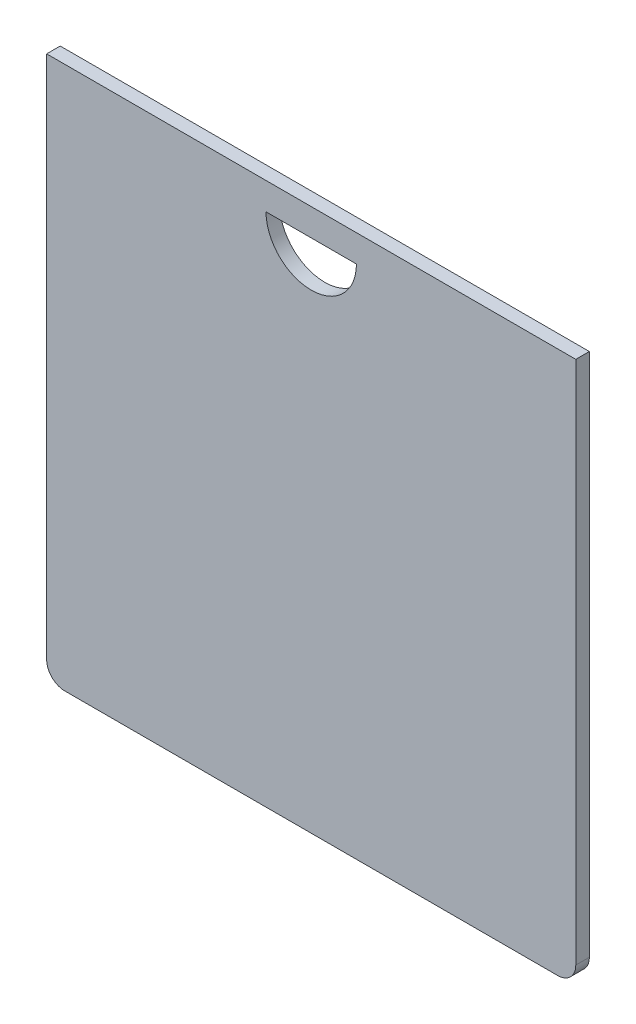
ISO-10303-21;
HEADER;
FILE_DESCRIPTION(('STEP AP214'),'2;1');
FILE_NAME('part.step','',(''),(''),'','','');
FILE_SCHEMA(('AUTOMOTIVE_DESIGN { 1 0 10303 214 1 1 1 1 }'));
ENDSEC;
DATA;
#1=APPLICATION_CONTEXT('core data for automotive mechanical design processes');
#2=APPLICATION_PROTOCOL_DEFINITION('international standard','automotive_design',2000,#1);
#3=PRODUCT_CONTEXT('',#1,'mechanical');
#4=PRODUCT('Part','Part','',(#3));
#5=PRODUCT_RELATED_PRODUCT_CATEGORY('part','',(#4));
#6=PRODUCT_DEFINITION_FORMATION('','',#4);
#7=PRODUCT_DEFINITION_CONTEXT('part definition',#1,'design');
#8=PRODUCT_DEFINITION('design','',#6,#7);
#9=PRODUCT_DEFINITION_SHAPE('','',#8);
#10=(LENGTH_UNIT() NAMED_UNIT(*) SI_UNIT(.MILLI.,.METRE.));
#11=(NAMED_UNIT(*) PLANE_ANGLE_UNIT() SI_UNIT($,.RADIAN.));
#12=(NAMED_UNIT(*) SI_UNIT($,.STERADIAN.) SOLID_ANGLE_UNIT());
#13=UNCERTAINTY_MEASURE_WITH_UNIT(LENGTH_MEASURE(1.E-05),#10,'distance_accuracy_value','');
#14=(GEOMETRIC_REPRESENTATION_CONTEXT(3) GLOBAL_UNCERTAINTY_ASSIGNED_CONTEXT((#13)) GLOBAL_UNIT_ASSIGNED_CONTEXT((#10,
#11,#12)) REPRESENTATION_CONTEXT('',''));
#15=CARTESIAN_POINT('',(0.,0.,0.));
#16=DIRECTION('',(0.,0.,1.));
#17=DIRECTION('',(1.,0.,0.));
#18=AXIS2_PLACEMENT_3D('',#15,#16,#17);
#19=CARTESIAN_POINT('',(0.,60.,1.5));
#20=DIRECTION('',(1.,0.,0.));
#21=DIRECTION('',(0.,1.,0.));
#22=AXIS2_PLACEMENT_3D('',#19,#20,#21);
#23=PLANE('',#22);
#24=DIRECTION('',(0.,-1.,0.));
#25=VECTOR('',#24,1.);
#26=CARTESIAN_POINT('',(0.,60.,0.));
#27=LINE('',#26,#25);
#28=CARTESIAN_POINT('',(0.,60.,0.));
#29=VERTEX_POINT('',#28);
#30=CARTESIAN_POINT('',(0.,2.,0.));
#31=VERTEX_POINT('',#30);
#32=EDGE_CURVE('E113',#29,#31,#27,.T.);
#33=ORIENTED_EDGE('',*,*,#32,.T.);
#34=DIRECTION('',(0.,0.,-1.));
#35=VECTOR('',#34,1.);
#36=CARTESIAN_POINT('',(0.,2.,1.5));
#37=LINE('',#36,#35);
#38=CARTESIAN_POINT('',(0.,2.,1.5));
#39=VERTEX_POINT('',#38);
#40=EDGE_CURVE('E11',#31,#39,#37,.F.);
#41=ORIENTED_EDGE('',*,*,#40,.T.);
#42=DIRECTION('',(0.,-1.,0.));
#43=VECTOR('',#42,1.);
#44=CARTESIAN_POINT('',(0.,60.,1.5));
#45=LINE('',#44,#43);
#46=CARTESIAN_POINT('',(0.,60.,1.5));
#47=VERTEX_POINT('',#46);
#48=EDGE_CURVE('E115',#47,#39,#45,.T.);
#49=ORIENTED_EDGE('',*,*,#48,.F.);
#50=DIRECTION('',(0.,0.,-1.));
#51=VECTOR('',#50,1.);
#52=CARTESIAN_POINT('',(0.,60.,1.5));
#53=LINE('',#52,#51);
#54=EDGE_CURVE('E126',#47,#29,#53,.T.);
#55=ORIENTED_EDGE('',*,*,#54,.T.);
#56=EDGE_LOOP('',(#33,#41,#49,#55));
#57=FACE_BOUND('',#56,.T.);
#58=ADVANCED_FACE('F33',(#57),#23,.F.);
#59=CARTESIAN_POINT('',(0.,0.,1.5));
#60=DIRECTION('',(0.,1.,0.));
#61=DIRECTION('',(0.,0.,1.));
#62=AXIS2_PLACEMENT_3D('',#59,#60,#61);
#63=PLANE('',#62);
#64=DIRECTION('',(1.,0.,0.));
#65=VECTOR('',#64,1.);
#66=CARTESIAN_POINT('',(0.,0.,0.));
#67=LINE('',#66,#65);
#68=CARTESIAN_POINT('',(2.,0.,0.));
#69=VERTEX_POINT('',#68);
#70=CARTESIAN_POINT('',(56.5,0.,0.));
#71=VERTEX_POINT('',#70);
#72=EDGE_CURVE('E129',#69,#71,#67,.T.);
#73=ORIENTED_EDGE('',*,*,#72,.T.);
#74=DIRECTION('',(0.,0.,-1.));
#75=VECTOR('',#74,1.);
#76=CARTESIAN_POINT('',(56.5,0.,1.5));
#77=LINE('',#76,#75);
#78=CARTESIAN_POINT('',(56.5,0.,1.5));
#79=VERTEX_POINT('',#78);
#80=EDGE_CURVE('E150',#71,#79,#77,.F.);
#81=ORIENTED_EDGE('',*,*,#80,.T.);
#82=DIRECTION('',(1.,0.,0.));
#83=VECTOR('',#82,1.);
#84=CARTESIAN_POINT('',(0.,0.,1.5));
#85=LINE('',#84,#83);
#86=CARTESIAN_POINT('',(2.,0.,1.5));
#87=VERTEX_POINT('',#86);
#88=EDGE_CURVE('E118',#87,#79,#85,.T.);
#89=ORIENTED_EDGE('',*,*,#88,.F.);
#90=DIRECTION('',(0.,0.,-1.));
#91=VECTOR('',#90,1.);
#92=CARTESIAN_POINT('',(2.,0.,1.5));
#93=LINE('',#92,#91);
#94=EDGE_CURVE('E147',#87,#69,#93,.T.);
#95=ORIENTED_EDGE('',*,*,#94,.T.);
#96=EDGE_LOOP('',(#73,#81,#89,#95));
#97=FACE_BOUND('',#96,.T.);
#98=ADVANCED_FACE('F170',(#97),#63,.F.);
#99=CARTESIAN_POINT('',(58.5,60.,1.5));
#100=DIRECTION('',(-1.,0.,0.));
#101=DIRECTION('',(0.,-1.,0.));
#102=AXIS2_PLACEMENT_3D('',#99,#100,#101);
#103=PLANE('',#102);
#104=DIRECTION('',(0.,1.,0.));
#105=VECTOR('',#104,1.);
#106=CARTESIAN_POINT('',(58.5,60.,1.5));
#107=LINE('',#106,#105);
#108=CARTESIAN_POINT('',(58.5,2.,1.5));
#109=VERTEX_POINT('',#108);
#110=CARTESIAN_POINT('',(58.5,60.,1.5));
#111=VERTEX_POINT('',#110);
#112=EDGE_CURVE('E122',#109,#111,#107,.T.);
#113=ORIENTED_EDGE('',*,*,#112,.F.);
#114=DIRECTION('',(0.,0.,-1.));
#115=VECTOR('',#114,1.);
#116=CARTESIAN_POINT('',(58.5,2.,1.5));
#117=LINE('',#116,#115);
#118=CARTESIAN_POINT('',(58.5,2.,0.));
#119=VERTEX_POINT('',#118);
#120=EDGE_CURVE('E140',#109,#119,#117,.T.);
#121=ORIENTED_EDGE('',*,*,#120,.T.);
#122=DIRECTION('',(0.,1.,0.));
#123=VECTOR('',#122,1.);
#124=CARTESIAN_POINT('',(58.5,60.,0.));
#125=LINE('',#124,#123);
#126=CARTESIAN_POINT('',(58.5,60.,0.));
#127=VERTEX_POINT('',#126);
#128=EDGE_CURVE('E132',#119,#127,#125,.T.);
#129=ORIENTED_EDGE('',*,*,#128,.T.);
#130=DIRECTION('',(0.,0.,-1.));
#131=VECTOR('',#130,1.);
#132=CARTESIAN_POINT('',(58.5,60.,1.5));
#133=LINE('',#132,#131);
#134=EDGE_CURVE('E137',#111,#127,#133,.T.);
#135=ORIENTED_EDGE('',*,*,#134,.F.);
#136=EDGE_LOOP('',(#113,#121,#129,#135));
#137=FACE_BOUND('',#136,.T.);
#138=ADVANCED_FACE('F163',(#137),#103,.F.);
#139=CARTESIAN_POINT('',(0.,60.,1.5));
#140=DIRECTION('',(0.,-1.,0.));
#141=DIRECTION('',(0.,0.,-1.));
#142=AXIS2_PLACEMENT_3D('',#139,#140,#141);
#143=PLANE('',#142);
#144=DIRECTION('',(-1.,0.,0.));
#145=VECTOR('',#144,1.);
#146=CARTESIAN_POINT('',(0.,60.,0.));
#147=LINE('',#146,#145);
#148=EDGE_CURVE('E119',#127,#29,#147,.T.);
#149=ORIENTED_EDGE('',*,*,#148,.T.);
#150=ORIENTED_EDGE('',*,*,#54,.F.);
#151=DIRECTION('',(-1.,0.,0.));
#152=VECTOR('',#151,1.);
#153=CARTESIAN_POINT('',(0.,60.,1.5));
#154=LINE('',#153,#152);
#155=EDGE_CURVE('E124',#111,#47,#154,.T.);
#156=ORIENTED_EDGE('',*,*,#155,.F.);
#157=ORIENTED_EDGE('',*,*,#134,.T.);
#158=EDGE_LOOP('',(#149,#150,#156,#157));
#159=FACE_BOUND('',#158,.T.);
#160=ADVANCED_FACE('F180',(#159),#143,.F.);
#161=CARTESIAN_POINT('',(0.,0.,1.5));
#162=DIRECTION('',(0.,0.,1.));
#163=DIRECTION('',(1.,0.,0.));
#164=AXIS2_PLACEMENT_3D('',#161,#162,#163);
#165=PLANE('',#164);
#166=CARTESIAN_POINT('',(29.25,57.,1.5));
#167=DIRECTION('',(0.,0.,1.));
#168=DIRECTION('',(1.,0.,0.));
#169=AXIS2_PLACEMENT_3D('',#166,#167,#168);
#170=CIRCLE('',#169,5.);
#171=CARTESIAN_POINT('',(24.25,57.,1.5));
#172=VERTEX_POINT('',#171);
#173=CARTESIAN_POINT('',(34.25,57.,1.5));
#174=VERTEX_POINT('',#173);
#175=EDGE_CURVE('E48',#172,#174,#170,.T.);
#176=ORIENTED_EDGE('',*,*,#175,.F.);
#177=DIRECTION('',(-1.,0.,0.));
#178=VECTOR('',#177,1.);
#179=CARTESIAN_POINT('',(24.25,57.,1.5));
#180=LINE('',#179,#178);
#181=EDGE_CURVE('E108',#174,#172,#180,.T.);
#182=ORIENTED_EDGE('',*,*,#181,.F.);
#183=EDGE_LOOP('',(#176,#182));
#184=FACE_BOUND('',#183,.T.);
#185=ORIENTED_EDGE('',*,*,#88,.T.);
#186=CARTESIAN_POINT('',(56.5,2.,1.5));
#187=DIRECTION('',(0.,0.,1.));
#188=DIRECTION('',(1.,0.,0.));
#189=AXIS2_PLACEMENT_3D('',#186,#187,#188);
#190=CIRCLE('',#189,2.);
#191=EDGE_CURVE('E41',#79,#109,#190,.T.);
#192=ORIENTED_EDGE('',*,*,#191,.T.);
#193=ORIENTED_EDGE('',*,*,#112,.T.);
#194=ORIENTED_EDGE('',*,*,#155,.T.);
#195=ORIENTED_EDGE('',*,*,#48,.T.);
#196=CARTESIAN_POINT('',(2.,2.,1.5));
#197=DIRECTION('',(0.,0.,1.));
#198=DIRECTION('',(1.,0.,0.));
#199=AXIS2_PLACEMENT_3D('',#196,#197,#198);
#200=CIRCLE('',#199,2.);
#201=EDGE_CURVE('E152',#39,#87,#200,.T.);
#202=ORIENTED_EDGE('',*,*,#201,.T.);
#203=EDGE_LOOP('',(#185,#192,#193,#194,#195,#202));
#204=FACE_BOUND('',#203,.T.);
#205=ADVANCED_FACE('F156',(#184,#204),#165,.T.);
#206=CARTESIAN_POINT('',(0.,0.,0.));
#207=DIRECTION('',(0.,0.,1.));
#208=DIRECTION('',(1.,0.,0.));
#209=AXIS2_PLACEMENT_3D('',#206,#207,#208);
#210=PLANE('',#209);
#211=DIRECTION('',(-1.,0.,0.));
#212=VECTOR('',#211,1.);
#213=CARTESIAN_POINT('',(24.25,57.,0.));
#214=LINE('',#213,#212);
#215=CARTESIAN_POINT('',(34.25,57.,0.));
#216=VERTEX_POINT('',#215);
#217=CARTESIAN_POINT('',(24.25,57.,0.));
#218=VERTEX_POINT('',#217);
#219=EDGE_CURVE('E100',#216,#218,#214,.T.);
#220=ORIENTED_EDGE('',*,*,#219,.T.);
#221=CARTESIAN_POINT('',(29.25,57.,0.));
#222=DIRECTION('',(0.,0.,1.));
#223=DIRECTION('',(1.,0.,0.));
#224=AXIS2_PLACEMENT_3D('',#221,#222,#223);
#225=CIRCLE('',#224,5.);
#226=EDGE_CURVE('E53',#218,#216,#225,.T.);
#227=ORIENTED_EDGE('',*,*,#226,.T.);
#228=EDGE_LOOP('',(#220,#227));
#229=FACE_BOUND('',#228,.T.);
#230=ORIENTED_EDGE('',*,*,#128,.F.);
#231=CARTESIAN_POINT('',(56.5,2.,0.));
#232=DIRECTION('',(0.,0.,1.));
#233=DIRECTION('',(1.,0.,0.));
#234=AXIS2_PLACEMENT_3D('',#231,#232,#233);
#235=CIRCLE('',#234,2.);
#236=EDGE_CURVE('E145',#119,#71,#235,.F.);
#237=ORIENTED_EDGE('',*,*,#236,.T.);
#238=ORIENTED_EDGE('',*,*,#72,.F.);
#239=CARTESIAN_POINT('',(2.,2.,0.));
#240=DIRECTION('',(0.,0.,1.));
#241=DIRECTION('',(1.,0.,0.));
#242=AXIS2_PLACEMENT_3D('',#239,#240,#241);
#243=CIRCLE('',#242,2.);
#244=EDGE_CURVE('E143',#69,#31,#243,.F.);
#245=ORIENTED_EDGE('',*,*,#244,.T.);
#246=ORIENTED_EDGE('',*,*,#32,.F.);
#247=ORIENTED_EDGE('',*,*,#148,.F.);
#248=EDGE_LOOP('',(#230,#237,#238,#245,#246,#247));
#249=FACE_BOUND('',#248,.T.);
#250=ADVANCED_FACE('F106',(#229,#249),#210,.F.);
#251=CARTESIAN_POINT('',(56.5,2.,1.5));
#252=DIRECTION('',(0.,0.,-1.));
#253=DIRECTION('',(-1.,0.,0.));
#254=AXIS2_PLACEMENT_3D('',#251,#252,#253);
#255=CYLINDRICAL_SURFACE('',#254,2.);
#256=ORIENTED_EDGE('',*,*,#191,.F.);
#257=ORIENTED_EDGE('',*,*,#80,.F.);
#258=ORIENTED_EDGE('',*,*,#236,.F.);
#259=ORIENTED_EDGE('',*,*,#120,.F.);
#260=EDGE_LOOP('',(#256,#257,#258,#259));
#261=FACE_BOUND('',#260,.T.);
#262=ADVANCED_FACE('F166',(#261),#255,.T.);
#263=CARTESIAN_POINT('',(2.,2.,1.5));
#264=DIRECTION('',(0.,0.,-1.));
#265=DIRECTION('',(-1.,0.,0.));
#266=AXIS2_PLACEMENT_3D('',#263,#264,#265);
#267=CYLINDRICAL_SURFACE('',#266,2.);
#268=ORIENTED_EDGE('',*,*,#201,.F.);
#269=ORIENTED_EDGE('',*,*,#40,.F.);
#270=ORIENTED_EDGE('',*,*,#244,.F.);
#271=ORIENTED_EDGE('',*,*,#94,.F.);
#272=EDGE_LOOP('',(#268,#269,#270,#271));
#273=FACE_BOUND('',#272,.T.);
#274=ADVANCED_FACE('F35',(#273),#267,.T.);
#275=CARTESIAN_POINT('',(29.25,57.,0.));
#276=DIRECTION('',(0.,0.,1.));
#277=DIRECTION('',(1.,0.,0.));
#278=AXIS2_PLACEMENT_3D('',#275,#276,#277);
#279=CYLINDRICAL_SURFACE('',#278,5.);
#280=ORIENTED_EDGE('',*,*,#175,.T.);
#281=DIRECTION('',(0.,0.,1.));
#282=VECTOR('',#281,1.);
#283=CARTESIAN_POINT('',(34.25,57.,0.));
#284=LINE('',#283,#282);
#285=EDGE_CURVE('E93',#216,#174,#284,.T.);
#286=ORIENTED_EDGE('',*,*,#285,.F.);
#287=ORIENTED_EDGE('',*,*,#226,.F.);
#288=DIRECTION('',(0.,0.,1.));
#289=VECTOR('',#288,1.);
#290=CARTESIAN_POINT('',(24.25,57.,0.));
#291=LINE('',#290,#289);
#292=EDGE_CURVE('E99',#218,#172,#291,.T.);
#293=ORIENTED_EDGE('',*,*,#292,.T.);
#294=EDGE_LOOP('',(#280,#286,#287,#293));
#295=FACE_BOUND('',#294,.T.);
#296=ADVANCED_FACE('F95',(#295),#279,.F.);
#297=CARTESIAN_POINT('',(24.25,57.,0.));
#298=DIRECTION('',(0.,1.,0.));
#299=DIRECTION('',(0.,0.,1.));
#300=AXIS2_PLACEMENT_3D('',#297,#298,#299);
#301=PLANE('',#300);
#302=ORIENTED_EDGE('',*,*,#181,.T.);
#303=ORIENTED_EDGE('',*,*,#292,.F.);
#304=ORIENTED_EDGE('',*,*,#219,.F.);
#305=ORIENTED_EDGE('',*,*,#285,.T.);
#306=EDGE_LOOP('',(#302,#303,#304,#305));
#307=FACE_BOUND('',#306,.T.);
#308=ADVANCED_FACE('F103',(#307),#301,.F.);
#309=CLOSED_SHELL('',(#58,#98,#138,#160,#205,#250,#262,#274,#296,#308));
#310=MANIFOLD_SOLID_BREP('B2',#309);
#311=ADVANCED_BREP_SHAPE_REPRESENTATION('',(#18,#310),#14);
#312=SHAPE_DEFINITION_REPRESENTATION(#9,#311);
ENDSEC;
END-ISO-10303-21;
